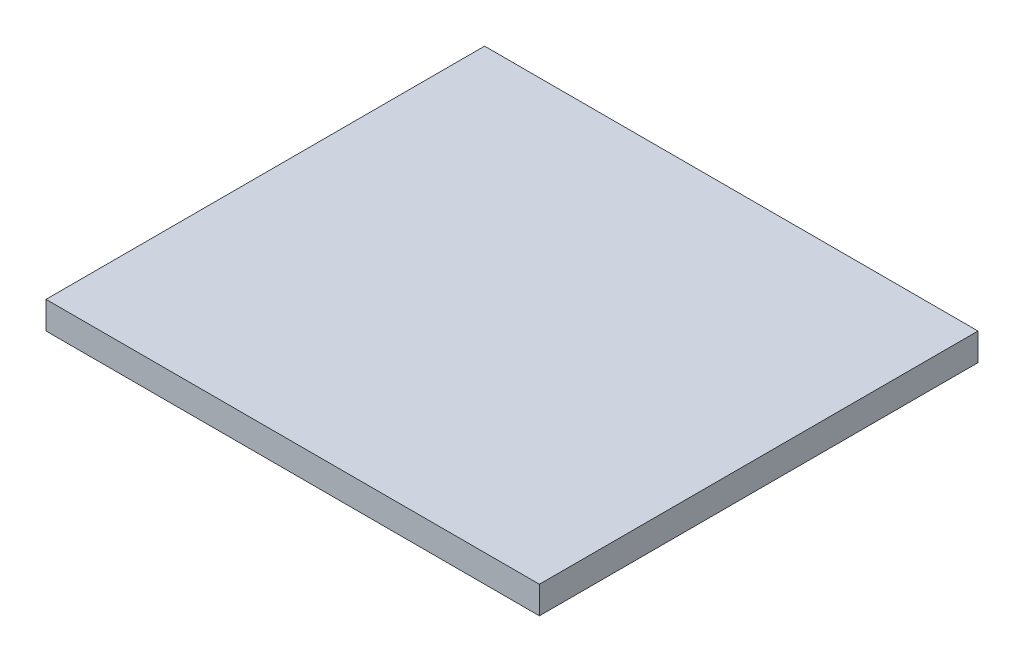
ISO-10303-21;
HEADER;
FILE_DESCRIPTION(('STEP AP214'),'2;1');
FILE_NAME('part.step','',(''),(''),'','','');
FILE_SCHEMA(('AUTOMOTIVE_DESIGN { 1 0 10303 214 1 1 1 1 }'));
ENDSEC;
DATA;
#1=APPLICATION_CONTEXT('core data for automotive mechanical design processes');
#2=APPLICATION_PROTOCOL_DEFINITION('international standard','automotive_design',2000,#1);
#3=PRODUCT_CONTEXT('',#1,'mechanical');
#4=PRODUCT('Part','Part','',(#3));
#5=PRODUCT_RELATED_PRODUCT_CATEGORY('part','',(#4));
#6=PRODUCT_DEFINITION_FORMATION('','',#4);
#7=PRODUCT_DEFINITION_CONTEXT('part definition',#1,'design');
#8=PRODUCT_DEFINITION('design','',#6,#7);
#9=PRODUCT_DEFINITION_SHAPE('','',#8);
#10=(LENGTH_UNIT() NAMED_UNIT(*) SI_UNIT(.MILLI.,.METRE.));
#11=(NAMED_UNIT(*) PLANE_ANGLE_UNIT() SI_UNIT($,.RADIAN.));
#12=(NAMED_UNIT(*) SI_UNIT($,.STERADIAN.) SOLID_ANGLE_UNIT());
#13=UNCERTAINTY_MEASURE_WITH_UNIT(LENGTH_MEASURE(1.E-05),#10,'distance_accuracy_value','');
#14=(GEOMETRIC_REPRESENTATION_CONTEXT(3) GLOBAL_UNCERTAINTY_ASSIGNED_CONTEXT((#13)) GLOBAL_UNIT_ASSIGNED_CONTEXT((#10,
#11,#12)) REPRESENTATION_CONTEXT('',''));
#15=CARTESIAN_POINT('',(0.,0.,0.));
#16=DIRECTION('',(0.,0.,1.));
#17=DIRECTION('',(1.,0.,0.));
#18=AXIS2_PLACEMENT_3D('',#15,#16,#17);
#19=CARTESIAN_POINT('',(45.,2.5,80.));
#20=DIRECTION('',(-1.,0.,0.));
#21=DIRECTION('',(0.,0.,1.));
#22=AXIS2_PLACEMENT_3D('',#19,#20,#21);
#23=PLANE('',#22);
#24=DIRECTION('',(0.,1.,0.));
#25=VECTOR('',#24,1.);
#26=CARTESIAN_POINT('',(45.,2.5,0.));
#27=LINE('',#26,#25);
#28=CARTESIAN_POINT('',(45.,-2.5,0.));
#29=VERTEX_POINT('',#28);
#30=CARTESIAN_POINT('',(45.,2.5,0.));
#31=VERTEX_POINT('',#30);
#32=EDGE_CURVE('E96',#29,#31,#27,.T.);
#33=ORIENTED_EDGE('',*,*,#32,.T.);
#34=DIRECTION('',(0.,0.,-1.));
#35=VECTOR('',#34,1.);
#36=CARTESIAN_POINT('',(45.,2.5,80.));
#37=LINE('',#36,#35);
#38=CARTESIAN_POINT('',(45.,2.5,80.));
#39=VERTEX_POINT('',#38);
#40=EDGE_CURVE('E11',#39,#31,#37,.T.);
#41=ORIENTED_EDGE('',*,*,#40,.F.);
#42=DIRECTION('',(0.,1.,0.));
#43=VECTOR('',#42,1.);
#44=CARTESIAN_POINT('',(45.,2.5,80.));
#45=LINE('',#44,#43);
#46=CARTESIAN_POINT('',(45.,-2.5,80.));
#47=VERTEX_POINT('',#46);
#48=EDGE_CURVE('E84',#47,#39,#45,.T.);
#49=ORIENTED_EDGE('',*,*,#48,.F.);
#50=DIRECTION('',(0.,0.,-1.));
#51=VECTOR('',#50,1.);
#52=CARTESIAN_POINT('',(45.,-2.5,80.));
#53=LINE('',#52,#51);
#54=EDGE_CURVE('E92',#47,#29,#53,.T.);
#55=ORIENTED_EDGE('',*,*,#54,.T.);
#56=EDGE_LOOP('',(#33,#41,#49,#55));
#57=FACE_BOUND('',#56,.T.);
#58=ADVANCED_FACE('F33',(#57),#23,.F.);
#59=CARTESIAN_POINT('',(-45.,2.5,80.));
#60=DIRECTION('',(0.,-1.,0.));
#61=DIRECTION('',(0.,0.,-1.));
#62=AXIS2_PLACEMENT_3D('',#59,#60,#61);
#63=PLANE('',#62);
#64=DIRECTION('',(-1.,0.,0.));
#65=VECTOR('',#64,1.);
#66=CARTESIAN_POINT('',(-45.,2.5,0.));
#67=LINE('',#66,#65);
#68=CARTESIAN_POINT('',(-45.,2.5,0.));
#69=VERTEX_POINT('',#68);
#70=EDGE_CURVE('E88',#31,#69,#67,.T.);
#71=ORIENTED_EDGE('',*,*,#70,.T.);
#72=DIRECTION('',(0.,0.,-1.));
#73=VECTOR('',#72,1.);
#74=CARTESIAN_POINT('',(-45.,2.5,80.));
#75=LINE('',#74,#73);
#76=CARTESIAN_POINT('',(-45.,2.5,80.));
#77=VERTEX_POINT('',#76);
#78=EDGE_CURVE('E41',#77,#69,#75,.T.);
#79=ORIENTED_EDGE('',*,*,#78,.F.);
#80=DIRECTION('',(-1.,0.,0.));
#81=VECTOR('',#80,1.);
#82=CARTESIAN_POINT('',(-45.,2.5,80.));
#83=LINE('',#82,#81);
#84=EDGE_CURVE('E79',#39,#77,#83,.T.);
#85=ORIENTED_EDGE('',*,*,#84,.F.);
#86=ORIENTED_EDGE('',*,*,#40,.T.);
#87=EDGE_LOOP('',(#71,#79,#85,#86));
#88=FACE_BOUND('',#87,.T.);
#89=ADVANCED_FACE('F87',(#88),#63,.F.);
#90=CARTESIAN_POINT('',(-45.,2.5,80.));
#91=DIRECTION('',(1.,0.,0.));
#92=DIRECTION('',(0.,0.,-1.));
#93=AXIS2_PLACEMENT_3D('',#90,#91,#92);
#94=PLANE('',#93);
#95=DIRECTION('',(0.,-1.,0.));
#96=VECTOR('',#95,1.);
#97=CARTESIAN_POINT('',(-45.,2.5,0.));
#98=LINE('',#97,#96);
#99=CARTESIAN_POINT('',(-45.,-2.5,0.));
#100=VERTEX_POINT('',#99);
#101=EDGE_CURVE('E66',#69,#100,#98,.T.);
#102=ORIENTED_EDGE('',*,*,#101,.T.);
#103=DIRECTION('',(0.,0.,-1.));
#104=VECTOR('',#103,1.);
#105=CARTESIAN_POINT('',(-45.,-2.5,80.));
#106=LINE('',#105,#104);
#107=CARTESIAN_POINT('',(-45.,-2.5,80.));
#108=VERTEX_POINT('',#107);
#109=EDGE_CURVE('E89',#108,#100,#106,.T.);
#110=ORIENTED_EDGE('',*,*,#109,.F.);
#111=DIRECTION('',(0.,-1.,0.));
#112=VECTOR('',#111,1.);
#113=CARTESIAN_POINT('',(-45.,2.5,80.));
#114=LINE('',#113,#112);
#115=EDGE_CURVE('E82',#77,#108,#114,.T.);
#116=ORIENTED_EDGE('',*,*,#115,.F.);
#117=ORIENTED_EDGE('',*,*,#78,.T.);
#118=EDGE_LOOP('',(#102,#110,#116,#117));
#119=FACE_BOUND('',#118,.T.);
#120=ADVANCED_FACE('F90',(#119),#94,.F.);
#121=CARTESIAN_POINT('',(-45.,-2.5,80.));
#122=DIRECTION('',(0.,1.,0.));
#123=DIRECTION('',(0.,0.,1.));
#124=AXIS2_PLACEMENT_3D('',#121,#122,#123);
#125=PLANE('',#124);
#126=DIRECTION('',(1.,0.,0.));
#127=VECTOR('',#126,1.);
#128=CARTESIAN_POINT('',(-45.,-2.5,0.));
#129=LINE('',#128,#127);
#130=EDGE_CURVE('E72',#100,#29,#129,.T.);
#131=ORIENTED_EDGE('',*,*,#130,.T.);
#132=ORIENTED_EDGE('',*,*,#54,.F.);
#133=DIRECTION('',(1.,0.,0.));
#134=VECTOR('',#133,1.);
#135=CARTESIAN_POINT('',(-45.,-2.5,80.));
#136=LINE('',#135,#134);
#137=EDGE_CURVE('E49',#108,#47,#136,.T.);
#138=ORIENTED_EDGE('',*,*,#137,.F.);
#139=ORIENTED_EDGE('',*,*,#109,.T.);
#140=EDGE_LOOP('',(#131,#132,#138,#139));
#141=FACE_BOUND('',#140,.T.);
#142=ADVANCED_FACE('F103',(#141),#125,.F.);
#143=CARTESIAN_POINT('',(0.,0.,80.));
#144=DIRECTION('',(0.,0.,1.));
#145=DIRECTION('',(1.,0.,0.));
#146=AXIS2_PLACEMENT_3D('',#143,#144,#145);
#147=PLANE('',#146);
#148=ORIENTED_EDGE('',*,*,#48,.T.);
#149=ORIENTED_EDGE('',*,*,#84,.T.);
#150=ORIENTED_EDGE('',*,*,#115,.T.);
#151=ORIENTED_EDGE('',*,*,#137,.T.);
#152=EDGE_LOOP('',(#148,#149,#150,#151));
#153=FACE_BOUND('',#152,.T.);
#154=ADVANCED_FACE('F80',(#153),#147,.T.);
#155=CARTESIAN_POINT('',(0.,0.,0.));
#156=DIRECTION('',(0.,0.,1.));
#157=DIRECTION('',(1.,0.,0.));
#158=AXIS2_PLACEMENT_3D('',#155,#156,#157);
#159=PLANE('',#158);
#160=ORIENTED_EDGE('',*,*,#32,.F.);
#161=ORIENTED_EDGE('',*,*,#130,.F.);
#162=ORIENTED_EDGE('',*,*,#101,.F.);
#163=ORIENTED_EDGE('',*,*,#70,.F.);
#164=EDGE_LOOP('',(#160,#161,#162,#163));
#165=FACE_BOUND('',#164,.T.);
#166=ADVANCED_FACE('F106',(#165),#159,.F.);
#167=CLOSED_SHELL('',(#58,#89,#120,#142,#154,#166));
#168=MANIFOLD_SOLID_BREP('B2',#167);
#169=ADVANCED_BREP_SHAPE_REPRESENTATION('',(#18,#168),#14);
#170=SHAPE_DEFINITION_REPRESENTATION(#9,#169);
ENDSEC;
END-ISO-10303-21;
